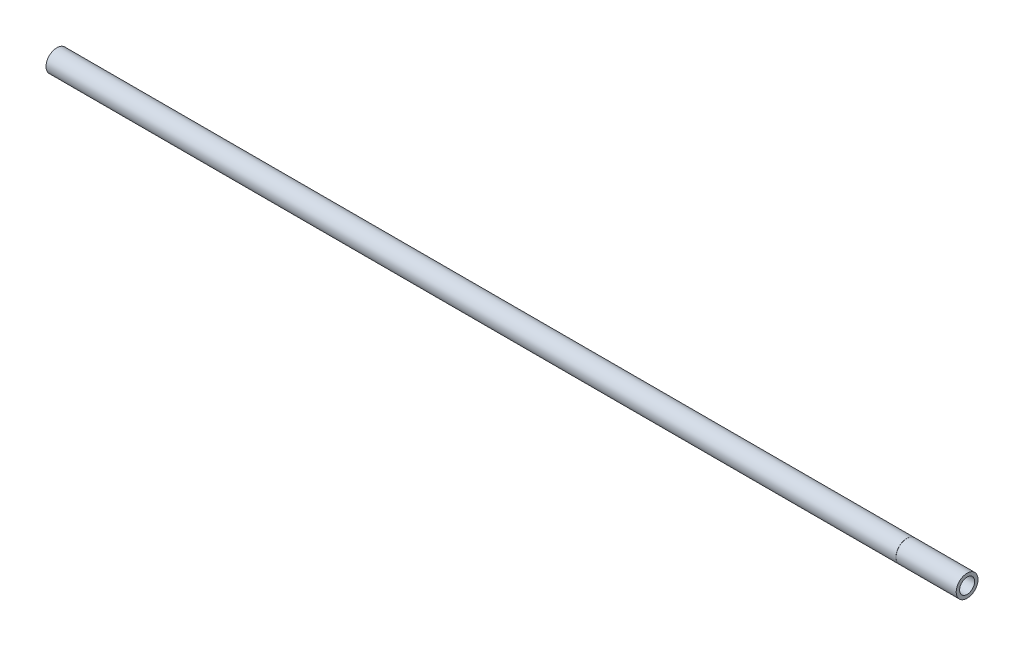
ISO-10303-21;
HEADER;
FILE_DESCRIPTION(('STEP AP214'),'2;1');
FILE_NAME('part.step','',(''),(''),'','','');
FILE_SCHEMA(('AUTOMOTIVE_DESIGN { 1 0 10303 214 1 1 1 1 }'));
ENDSEC;
DATA;
#1=APPLICATION_CONTEXT('core data for automotive mechanical design processes');
#2=APPLICATION_PROTOCOL_DEFINITION('international standard','automotive_design',2000,#1);
#3=PRODUCT_CONTEXT('',#1,'mechanical');
#4=PRODUCT('Part','Part','',(#3));
#5=PRODUCT_RELATED_PRODUCT_CATEGORY('part','',(#4));
#6=PRODUCT_DEFINITION_FORMATION('','',#4);
#7=PRODUCT_DEFINITION_CONTEXT('part definition',#1,'design');
#8=PRODUCT_DEFINITION('design','',#6,#7);
#9=PRODUCT_DEFINITION_SHAPE('','',#8);
#10=(LENGTH_UNIT() NAMED_UNIT(*) SI_UNIT(.MILLI.,.METRE.));
#11=(NAMED_UNIT(*) PLANE_ANGLE_UNIT() SI_UNIT($,.RADIAN.));
#12=(NAMED_UNIT(*) SI_UNIT($,.STERADIAN.) SOLID_ANGLE_UNIT());
#13=UNCERTAINTY_MEASURE_WITH_UNIT(LENGTH_MEASURE(1.E-05),#10,'distance_accuracy_value','');
#14=(GEOMETRIC_REPRESENTATION_CONTEXT(3) GLOBAL_UNCERTAINTY_ASSIGNED_CONTEXT((#13)) GLOBAL_UNIT_ASSIGNED_CONTEXT((#10,
#11,#12)) REPRESENTATION_CONTEXT('',''));
#15=CARTESIAN_POINT('',(0.,0.,0.));
#16=DIRECTION('',(0.,0.,1.));
#17=DIRECTION('',(1.,0.,0.));
#18=AXIS2_PLACEMENT_3D('',#15,#16,#17);
#19=CARTESIAN_POINT('',(110.,0.,0.));
#20=DIRECTION('',(-1.,0.,0.));
#21=DIRECTION('',(0.,0.,1.));
#22=AXIS2_PLACEMENT_3D('',#19,#20,#21);
#23=CYLINDRICAL_SURFACE('',#22,0.96528919029875);
#24=CARTESIAN_POINT('',(110.,0.,0.));
#25=DIRECTION('',(-1.,0.,0.));
#26=DIRECTION('',(0.,0.,1.));
#27=AXIS2_PLACEMENT_3D('',#24,#25,#26);
#28=CIRCLE('',#27,0.96528919029875);
#29=CARTESIAN_POINT('',(110.,0.,0.96528919029875));
#30=VERTEX_POINT('',#29);
#31=EDGE_CURVE('E13',#30,#30,#28,.T.);
#32=ORIENTED_EDGE('',*,*,#31,.T.);
#33=EDGE_LOOP('',(#32));
#34=FACE_BOUND('',#33,.T.);
#35=CARTESIAN_POINT('',(0.,0.,0.));
#36=DIRECTION('',(-1.,0.,0.));
#37=DIRECTION('',(0.,0.,1.));
#38=AXIS2_PLACEMENT_3D('',#35,#36,#37);
#39=CIRCLE('',#38,0.96528919029875);
#40=CARTESIAN_POINT('',(0.,0.,0.96528919029875));
#41=VERTEX_POINT('',#40);
#42=EDGE_CURVE('E59',#41,#41,#39,.T.);
#43=ORIENTED_EDGE('',*,*,#42,.F.);
#44=EDGE_LOOP('',(#43));
#45=FACE_BOUND('',#44,.T.);
#46=ADVANCED_FACE('F56',(#34,#45),#23,.T.);
#47=CARTESIAN_POINT('',(110.,0.,0.));
#48=DIRECTION('',(-1.,0.,0.));
#49=DIRECTION('',(0.,0.,1.));
#50=AXIS2_PLACEMENT_3D('',#47,#48,#49);
#51=PLANE('',#50);
#52=ORIENTED_EDGE('',*,*,#31,.F.);
#53=EDGE_LOOP('',(#52));
#54=FACE_BOUND('',#53,.T.);
#55=ADVANCED_FACE('F71',(#54),#51,.F.);
#56=CARTESIAN_POINT('',(0.,0.,0.));
#57=DIRECTION('',(-1.,0.,0.));
#58=DIRECTION('',(0.,0.,1.));
#59=AXIS2_PLACEMENT_3D('',#56,#57,#58);
#60=PLANE('',#59);
#61=ORIENTED_EDGE('',*,*,#42,.T.);
#62=EDGE_LOOP('',(#61));
#63=FACE_BOUND('',#62,.T.);
#64=ADVANCED_FACE('F68',(#63),#60,.T.);
#65=CLOSED_SHELL('',(#46,#55,#64));
#66=MANIFOLD_SOLID_BREP('B2',#65);
#67=CARTESIAN_POINT('',(0.,0.,0.));
#68=DIRECTION('',(-1.,0.,0.));
#69=DIRECTION('',(0.,0.,1.));
#70=AXIS2_PLACEMENT_3D('',#67,#68,#69);
#71=CYLINDRICAL_SURFACE('',#70,1.);
#72=CARTESIAN_POINT('',(121.,0.,0.));
#73=DIRECTION('',(-1.,0.,0.));
#74=DIRECTION('',(0.,0.,1.));
#75=AXIS2_PLACEMENT_3D('',#72,#73,#74);
#76=CIRCLE('',#75,1.);
#77=CARTESIAN_POINT('',(121.,0.,1.));
#78=VERTEX_POINT('',#77);
#79=EDGE_CURVE('E149',#78,#78,#76,.T.);
#80=ORIENTED_EDGE('',*,*,#79,.F.);
#81=EDGE_LOOP('',(#80));
#82=FACE_BOUND('',#81,.T.);
#83=CARTESIAN_POINT('',(106.,0.,0.));
#84=DIRECTION('',(-1.,0.,0.));
#85=DIRECTION('',(0.,0.,1.));
#86=AXIS2_PLACEMENT_3D('',#83,#84,#85);
#87=CIRCLE('',#86,1.);
#88=CARTESIAN_POINT('',(106.,0.,1.));
#89=VERTEX_POINT('',#88);
#90=EDGE_CURVE('E55',#89,#89,#87,.T.);
#91=ORIENTED_EDGE('',*,*,#90,.T.);
#92=EDGE_LOOP('',(#91));
#93=FACE_BOUND('',#92,.T.);
#94=ADVANCED_FACE('F115',(#82,#93),#71,.F.);
#95=CARTESIAN_POINT('',(106.,1.,0.));
#96=DIRECTION('',(-1.,0.,0.));
#97=DIRECTION('',(0.,0.,1.));
#98=AXIS2_PLACEMENT_3D('',#95,#96,#97);
#99=PLANE('',#98);
#100=ORIENTED_EDGE('',*,*,#90,.F.);
#101=EDGE_LOOP('',(#100));
#102=FACE_BOUND('',#101,.T.);
#103=CARTESIAN_POINT('',(106.,0.,0.));
#104=DIRECTION('',(-1.,0.,0.));
#105=DIRECTION('',(0.,0.,1.));
#106=AXIS2_PLACEMENT_3D('',#103,#104,#105);
#107=CIRCLE('',#106,0.999);
#108=CARTESIAN_POINT('',(106.,0.,0.999));
#109=VERTEX_POINT('',#108);
#110=EDGE_CURVE('E121',#109,#109,#107,.T.);
#111=ORIENTED_EDGE('',*,*,#110,.T.);
#112=EDGE_LOOP('',(#111));
#113=FACE_BOUND('',#112,.T.);
#114=ADVANCED_FACE('F156',(#102,#113),#99,.F.);
#115=CARTESIAN_POINT('',(105.996267949192,0.,0.));
#116=DIRECTION('',(-1.,0.,0.));
#117=DIRECTION('',(0.,0.,1.));
#118=AXIS2_PLACEMENT_3D('',#115,#116,#117);
#119=CONICAL_SURFACE('',#118,1.,0.261799387798813);
#120=ORIENTED_EDGE('',*,*,#110,.F.);
#121=EDGE_LOOP('',(#120));
#122=FACE_BOUND('',#121,.T.);
#123=CARTESIAN_POINT('',(105.996267949192,0.,0.));
#124=DIRECTION('',(-1.,0.,0.));
#125=DIRECTION('',(0.,0.,1.));
#126=AXIS2_PLACEMENT_3D('',#123,#124,#125);
#127=CIRCLE('',#126,1.);
#128=CARTESIAN_POINT('',(105.996267949192,0.,1.));
#129=VERTEX_POINT('',#128);
#130=EDGE_CURVE('E125',#129,#129,#127,.T.);
#131=ORIENTED_EDGE('',*,*,#130,.T.);
#132=EDGE_LOOP('',(#131));
#133=FACE_BOUND('',#132,.T.);
#134=ADVANCED_FACE('F160',(#122,#133),#119,.F.);
#135=CARTESIAN_POINT('',(0.,0.,0.));
#136=DIRECTION('',(-1.,0.,0.));
#137=DIRECTION('',(0.,0.,1.));
#138=AXIS2_PLACEMENT_3D('',#135,#136,#137);
#139=CYLINDRICAL_SURFACE('',#138,1.);
#140=ORIENTED_EDGE('',*,*,#130,.F.);
#141=EDGE_LOOP('',(#140));
#142=FACE_BOUND('',#141,.T.);
#143=CARTESIAN_POINT('',(0.,0.,0.));
#144=DIRECTION('',(-1.,0.,0.));
#145=DIRECTION('',(0.,0.,1.));
#146=AXIS2_PLACEMENT_3D('',#143,#144,#145);
#147=CIRCLE('',#146,1.);
#148=CARTESIAN_POINT('',(0.,0.,1.));
#149=VERTEX_POINT('',#148);
#150=EDGE_CURVE('E129',#149,#149,#147,.T.);
#151=ORIENTED_EDGE('',*,*,#150,.T.);
#152=EDGE_LOOP('',(#151));
#153=FACE_BOUND('',#152,.T.);
#154=ADVANCED_FACE('F165',(#142,#153),#139,.F.);
#155=CARTESIAN_POINT('',(0.,1.45,0.));
#156=DIRECTION('',(1.,0.,0.));
#157=DIRECTION('',(0.,0.,-1.));
#158=AXIS2_PLACEMENT_3D('',#155,#156,#157);
#159=PLANE('',#158);
#160=ORIENTED_EDGE('',*,*,#150,.F.);
#161=EDGE_LOOP('',(#160));
#162=FACE_BOUND('',#161,.T.);
#163=CARTESIAN_POINT('',(0.,0.,0.));
#164=DIRECTION('',(-1.,0.,0.));
#165=DIRECTION('',(0.,0.,1.));
#166=AXIS2_PLACEMENT_3D('',#163,#164,#165);
#167=CIRCLE('',#166,1.45);
#168=CARTESIAN_POINT('',(0.,0.,1.45));
#169=VERTEX_POINT('',#168);
#170=EDGE_CURVE('E134',#169,#169,#167,.T.);
#171=ORIENTED_EDGE('',*,*,#170,.T.);
#172=EDGE_LOOP('',(#171));
#173=FACE_BOUND('',#172,.T.);
#174=ADVANCED_FACE('F171',(#162,#173),#159,.F.);
#175=CARTESIAN_POINT('',(0.,0.,0.));
#176=DIRECTION('',(-1.,0.,0.));
#177=DIRECTION('',(0.,0.,1.));
#178=AXIS2_PLACEMENT_3D('',#175,#176,#177);
#179=CYLINDRICAL_SURFACE('',#178,1.45);
#180=ORIENTED_EDGE('',*,*,#170,.F.);
#181=EDGE_LOOP('',(#180));
#182=FACE_BOUND('',#181,.T.);
#183=CARTESIAN_POINT('',(112.985008226436,0.,0.));
#184=DIRECTION('',(-1.,0.,0.));
#185=DIRECTION('',(0.,0.,1.));
#186=AXIS2_PLACEMENT_3D('',#183,#184,#185);
#187=CIRCLE('',#186,1.45);
#188=CARTESIAN_POINT('',(112.985008226436,0.,1.45));
#189=VERTEX_POINT('',#188);
#190=EDGE_CURVE('E137',#189,#189,#187,.T.);
#191=ORIENTED_EDGE('',*,*,#190,.T.);
#192=EDGE_LOOP('',(#191));
#193=FACE_BOUND('',#192,.T.);
#194=ADVANCED_FACE('F175',(#182,#193),#179,.T.);
#195=CARTESIAN_POINT('',(113.,0.,0.));
#196=DIRECTION('',(-1.,0.,0.));
#197=DIRECTION('',(0.,0.,1.));
#198=AXIS2_PLACEMENT_3D('',#195,#196,#197);
#199=CONICAL_SURFACE('',#198,1.44296000187769,0.439025627156803);
#200=ORIENTED_EDGE('',*,*,#190,.F.);
#201=EDGE_LOOP('',(#200));
#202=FACE_BOUND('',#201,.T.);
#203=CARTESIAN_POINT('',(113.,0.,0.));
#204=DIRECTION('',(-1.,0.,0.));
#205=DIRECTION('',(0.,0.,1.));
#206=AXIS2_PLACEMENT_3D('',#203,#204,#205);
#207=CIRCLE('',#206,1.44296000187769);
#208=CARTESIAN_POINT('',(113.,0.,1.44296000187769));
#209=VERTEX_POINT('',#208);
#210=EDGE_CURVE('E140',#209,#209,#207,.T.);
#211=ORIENTED_EDGE('',*,*,#210,.T.);
#212=EDGE_LOOP('',(#211));
#213=FACE_BOUND('',#212,.T.);
#214=ADVANCED_FACE('F179',(#202,#213),#199,.T.);
#215=CARTESIAN_POINT('',(113.,1.45,0.));
#216=DIRECTION('',(1.,0.,0.));
#217=DIRECTION('',(0.,0.,-1.));
#218=AXIS2_PLACEMENT_3D('',#215,#216,#217);
#219=PLANE('',#218);
#220=ORIENTED_EDGE('',*,*,#210,.F.);
#221=EDGE_LOOP('',(#220));
#222=FACE_BOUND('',#221,.T.);
#223=CARTESIAN_POINT('',(113.,0.,0.));
#224=DIRECTION('',(-1.,0.,0.));
#225=DIRECTION('',(0.,0.,1.));
#226=AXIS2_PLACEMENT_3D('',#223,#224,#225);
#227=CIRCLE('',#226,1.45);
#228=CARTESIAN_POINT('',(113.,0.,1.45));
#229=VERTEX_POINT('',#228);
#230=EDGE_CURVE('E143',#229,#229,#227,.T.);
#231=ORIENTED_EDGE('',*,*,#230,.T.);
#232=EDGE_LOOP('',(#231));
#233=FACE_BOUND('',#232,.T.);
#234=ADVANCED_FACE('F183',(#222,#233),#219,.F.);
#235=CARTESIAN_POINT('',(0.,0.,0.));
#236=DIRECTION('',(-1.,0.,0.));
#237=DIRECTION('',(0.,0.,1.));
#238=AXIS2_PLACEMENT_3D('',#235,#236,#237);
#239=CYLINDRICAL_SURFACE('',#238,1.45);
#240=ORIENTED_EDGE('',*,*,#230,.F.);
#241=EDGE_LOOP('',(#240));
#242=FACE_BOUND('',#241,.T.);
#243=CARTESIAN_POINT('',(121.,0.,0.));
#244=DIRECTION('',(-1.,0.,0.));
#245=DIRECTION('',(0.,0.,1.));
#246=AXIS2_PLACEMENT_3D('',#243,#244,#245);
#247=CIRCLE('',#246,1.45);
#248=CARTESIAN_POINT('',(121.,0.,1.45));
#249=VERTEX_POINT('',#248);
#250=EDGE_CURVE('E146',#249,#249,#247,.T.);
#251=ORIENTED_EDGE('',*,*,#250,.T.);
#252=EDGE_LOOP('',(#251));
#253=FACE_BOUND('',#252,.T.);
#254=ADVANCED_FACE('F187',(#242,#253),#239,.T.);
#255=CARTESIAN_POINT('',(121.,1.45,0.));
#256=DIRECTION('',(-1.,0.,0.));
#257=DIRECTION('',(0.,0.,1.));
#258=AXIS2_PLACEMENT_3D('',#255,#256,#257);
#259=PLANE('',#258);
#260=ORIENTED_EDGE('',*,*,#250,.F.);
#261=EDGE_LOOP('',(#260));
#262=FACE_BOUND('',#261,.T.);
#263=ORIENTED_EDGE('',*,*,#79,.T.);
#264=EDGE_LOOP('',(#263));
#265=FACE_BOUND('',#264,.T.);
#266=ADVANCED_FACE('F153',(#262,#265),#259,.F.);
#267=CLOSED_SHELL('',(#94,#114,#134,#154,#174,#194,#214,#234,#254,#266));
#268=MANIFOLD_SOLID_BREP('B8',#267);
#269=ADVANCED_BREP_SHAPE_REPRESENTATION('',(#18,#66,#268),#14);
#270=SHAPE_DEFINITION_REPRESENTATION(#9,#269);
ENDSEC;
END-ISO-10303-21;
